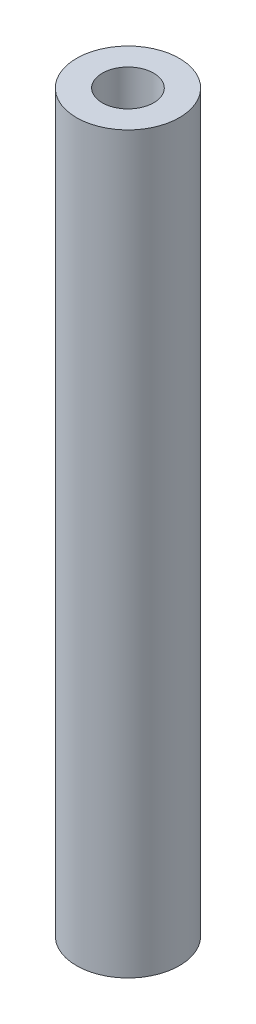
ISO-10303-21;
HEADER;
FILE_DESCRIPTION(('STEP AP214'),'2;1');
FILE_NAME('part.step','',(''),(''),'','','');
FILE_SCHEMA(('AUTOMOTIVE_DESIGN { 1 0 10303 214 1 1 1 1 }'));
ENDSEC;
DATA;
#1=APPLICATION_CONTEXT('core data for automotive mechanical design processes');
#2=APPLICATION_PROTOCOL_DEFINITION('international standard','automotive_design',2000,#1);
#3=PRODUCT_CONTEXT('',#1,'mechanical');
#4=PRODUCT('Part','Part','',(#3));
#5=PRODUCT_RELATED_PRODUCT_CATEGORY('part','',(#4));
#6=PRODUCT_DEFINITION_FORMATION('','',#4);
#7=PRODUCT_DEFINITION_CONTEXT('part definition',#1,'design');
#8=PRODUCT_DEFINITION('design','',#6,#7);
#9=PRODUCT_DEFINITION_SHAPE('','',#8);
#10=(LENGTH_UNIT() NAMED_UNIT(*) SI_UNIT(.MILLI.,.METRE.));
#11=(NAMED_UNIT(*) PLANE_ANGLE_UNIT() SI_UNIT($,.RADIAN.));
#12=(NAMED_UNIT(*) SI_UNIT($,.STERADIAN.) SOLID_ANGLE_UNIT());
#13=UNCERTAINTY_MEASURE_WITH_UNIT(LENGTH_MEASURE(1.E-05),#10,'distance_accuracy_value','');
#14=(GEOMETRIC_REPRESENTATION_CONTEXT(3) GLOBAL_UNCERTAINTY_ASSIGNED_CONTEXT((#13)) GLOBAL_UNIT_ASSIGNED_CONTEXT((#10,
#11,#12)) REPRESENTATION_CONTEXT('',''));
#15=CARTESIAN_POINT('',(0.,0.,0.));
#16=DIRECTION('',(0.,0.,1.));
#17=DIRECTION('',(1.,0.,0.));
#18=AXIS2_PLACEMENT_3D('',#15,#16,#17);
#19=CARTESIAN_POINT('',(0.,25.,0.));
#20=DIRECTION('',(0.,1.,0.));
#21=DIRECTION('',(0.,0.,1.));
#22=AXIS2_PLACEMENT_3D('',#19,#20,#21);
#23=PLANE('',#22);
#24=CARTESIAN_POINT('',(0.,25.,0.));
#25=DIRECTION('',(0.,1.,0.));
#26=DIRECTION('',(0.,0.,1.));
#27=AXIS2_PLACEMENT_3D('',#24,#25,#26);
#28=CIRCLE('',#27,3.5);
#29=CARTESIAN_POINT('',(0.,25.,3.5));
#30=VERTEX_POINT('',#29);
#31=EDGE_CURVE('E10',#30,#30,#28,.T.);
#32=ORIENTED_EDGE('',*,*,#31,.T.);
#33=EDGE_LOOP('',(#32));
#34=FACE_BOUND('',#33,.T.);
#35=CARTESIAN_POINT('',(0.,25.,0.));
#36=DIRECTION('',(0.,1.,0.));
#37=DIRECTION('',(0.,0.,1.));
#38=AXIS2_PLACEMENT_3D('',#35,#36,#37);
#39=CIRCLE('',#38,1.75);
#40=CARTESIAN_POINT('',(0.,25.,1.75));
#41=VERTEX_POINT('',#40);
#42=EDGE_CURVE('E42',#41,#41,#39,.T.);
#43=ORIENTED_EDGE('',*,*,#42,.F.);
#44=EDGE_LOOP('',(#43));
#45=FACE_BOUND('',#44,.T.);
#46=ADVANCED_FACE('F31',(#34,#45),#23,.T.);
#47=CARTESIAN_POINT('',(0.,-25.,0.));
#48=DIRECTION('',(0.,1.,0.));
#49=DIRECTION('',(0.,0.,1.));
#50=AXIS2_PLACEMENT_3D('',#47,#48,#49);
#51=PLANE('',#50);
#52=CARTESIAN_POINT('',(0.,-25.,0.));
#53=DIRECTION('',(0.,1.,0.));
#54=DIRECTION('',(0.,0.,1.));
#55=AXIS2_PLACEMENT_3D('',#52,#53,#54);
#56=CIRCLE('',#55,3.5);
#57=CARTESIAN_POINT('',(0.,-25.,3.5));
#58=VERTEX_POINT('',#57);
#59=EDGE_CURVE('E35',#58,#58,#56,.T.);
#60=ORIENTED_EDGE('',*,*,#59,.F.);
#61=EDGE_LOOP('',(#60));
#62=FACE_BOUND('',#61,.T.);
#63=CARTESIAN_POINT('',(0.,-25.,0.));
#64=DIRECTION('',(0.,1.,0.));
#65=DIRECTION('',(0.,0.,1.));
#66=AXIS2_PLACEMENT_3D('',#63,#64,#65);
#67=CIRCLE('',#66,1.75);
#68=CARTESIAN_POINT('',(0.,-25.,1.75));
#69=VERTEX_POINT('',#68);
#70=EDGE_CURVE('E44',#69,#69,#67,.T.);
#71=ORIENTED_EDGE('',*,*,#70,.T.);
#72=EDGE_LOOP('',(#71));
#73=FACE_BOUND('',#72,.T.);
#74=ADVANCED_FACE('F54',(#62,#73),#51,.F.);
#75=CARTESIAN_POINT('',(0.,25.,0.));
#76=DIRECTION('',(0.,-1.,0.));
#77=DIRECTION('',(0.,0.,-1.));
#78=AXIS2_PLACEMENT_3D('',#75,#76,#77);
#79=CYLINDRICAL_SURFACE('',#78,3.5);
#80=ORIENTED_EDGE('',*,*,#31,.F.);
#81=EDGE_LOOP('',(#80));
#82=FACE_BOUND('',#81,.T.);
#83=ORIENTED_EDGE('',*,*,#59,.T.);
#84=EDGE_LOOP('',(#83));
#85=FACE_BOUND('',#84,.T.);
#86=ADVANCED_FACE('F33',(#82,#85),#79,.T.);
#87=CARTESIAN_POINT('',(0.,25.,0.));
#88=DIRECTION('',(0.,-1.,0.));
#89=DIRECTION('',(0.,0.,-1.));
#90=AXIS2_PLACEMENT_3D('',#87,#88,#89);
#91=CYLINDRICAL_SURFACE('',#90,1.75);
#92=ORIENTED_EDGE('',*,*,#42,.T.);
#93=EDGE_LOOP('',(#92));
#94=FACE_BOUND('',#93,.T.);
#95=ORIENTED_EDGE('',*,*,#70,.F.);
#96=EDGE_LOOP('',(#95));
#97=FACE_BOUND('',#96,.T.);
#98=ADVANCED_FACE('F50',(#94,#97),#91,.F.);
#99=CLOSED_SHELL('',(#46,#74,#86,#98));
#100=MANIFOLD_SOLID_BREP('B2',#99);
#101=ADVANCED_BREP_SHAPE_REPRESENTATION('',(#18,#100),#14);
#102=SHAPE_DEFINITION_REPRESENTATION(#9,#101);
ENDSEC;
END-ISO-10303-21;
